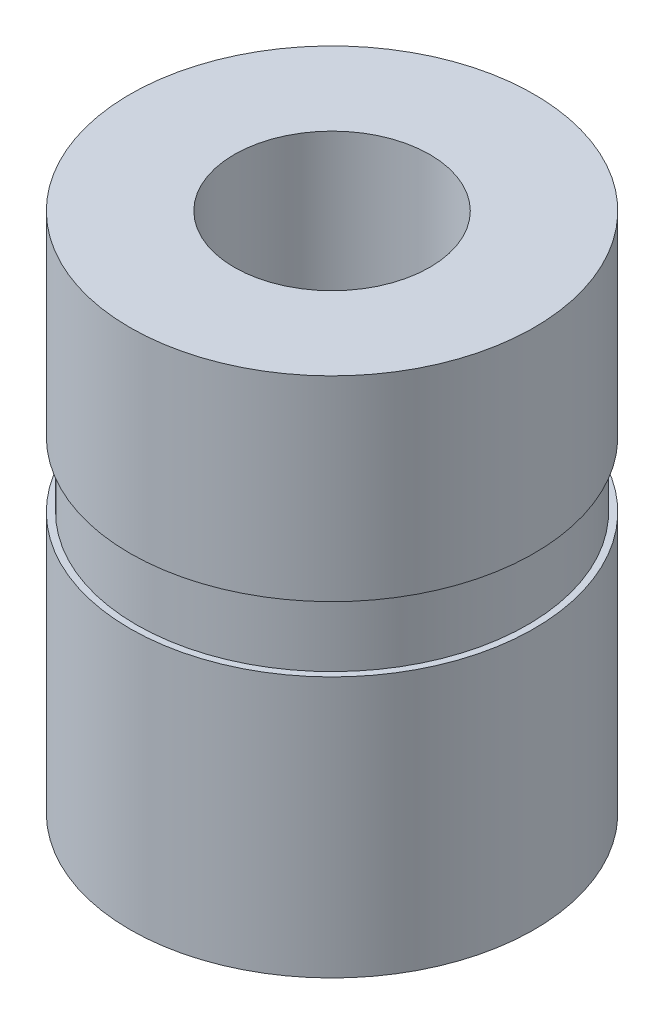
ISO-10303-21;
HEADER;
FILE_DESCRIPTION(('STEP AP214'),'2;1');
FILE_NAME('part.step','',(''),(''),'','','');
FILE_SCHEMA(('AUTOMOTIVE_DESIGN { 1 0 10303 214 1 1 1 1 }'));
ENDSEC;
DATA;
#1=APPLICATION_CONTEXT('core data for automotive mechanical design processes');
#2=APPLICATION_PROTOCOL_DEFINITION('international standard','automotive_design',2000,#1);
#3=PRODUCT_CONTEXT('',#1,'mechanical');
#4=PRODUCT('Part','Part','',(#3));
#5=PRODUCT_RELATED_PRODUCT_CATEGORY('part','',(#4));
#6=PRODUCT_DEFINITION_FORMATION('','',#4);
#7=PRODUCT_DEFINITION_CONTEXT('part definition',#1,'design');
#8=PRODUCT_DEFINITION('design','',#6,#7);
#9=PRODUCT_DEFINITION_SHAPE('','',#8);
#10=(LENGTH_UNIT() NAMED_UNIT(*) SI_UNIT(.MILLI.,.METRE.));
#11=(NAMED_UNIT(*) PLANE_ANGLE_UNIT() SI_UNIT($,.RADIAN.));
#12=(NAMED_UNIT(*) SI_UNIT($,.STERADIAN.) SOLID_ANGLE_UNIT());
#13=UNCERTAINTY_MEASURE_WITH_UNIT(LENGTH_MEASURE(1.E-05),#10,'distance_accuracy_value','');
#14=(GEOMETRIC_REPRESENTATION_CONTEXT(3) GLOBAL_UNCERTAINTY_ASSIGNED_CONTEXT((#13)) GLOBAL_UNIT_ASSIGNED_CONTEXT((#10,
#11,#12)) REPRESENTATION_CONTEXT('',''));
#15=CARTESIAN_POINT('',(0.,0.,0.));
#16=DIRECTION('',(0.,0.,1.));
#17=DIRECTION('',(1.,0.,0.));
#18=AXIS2_PLACEMENT_3D('',#15,#16,#17);
#19=CARTESIAN_POINT('',(0.,4.,0.));
#20=DIRECTION('',(0.,-1.,0.));
#21=DIRECTION('',(0.,0.,-1.));
#22=AXIS2_PLACEMENT_3D('',#19,#20,#21);
#23=CYLINDRICAL_SURFACE('',#22,3.1);
#24=CARTESIAN_POINT('',(0.,4.,0.));
#25=DIRECTION('',(0.,1.,0.));
#26=DIRECTION('',(0.,0.,1.));
#27=AXIS2_PLACEMENT_3D('',#24,#25,#26);
#28=CIRCLE('',#27,3.1);
#29=CARTESIAN_POINT('',(0.,4.,3.1));
#30=VERTEX_POINT('',#29);
#31=EDGE_CURVE('E47',#30,#30,#28,.T.);
#32=ORIENTED_EDGE('',*,*,#31,.F.);
#33=EDGE_LOOP('',(#32));
#34=FACE_BOUND('',#33,.T.);
#35=CARTESIAN_POINT('',(0.,0.,0.));
#36=DIRECTION('',(0.,1.,0.));
#37=DIRECTION('',(0.,0.,1.));
#38=AXIS2_PLACEMENT_3D('',#35,#36,#37);
#39=CIRCLE('',#38,3.1);
#40=CARTESIAN_POINT('',(0.,0.,3.1));
#41=VERTEX_POINT('',#40);
#42=EDGE_CURVE('E51',#41,#41,#39,.T.);
#43=ORIENTED_EDGE('',*,*,#42,.T.);
#44=EDGE_LOOP('',(#43));
#45=FACE_BOUND('',#44,.T.);
#46=ADVANCED_FACE('F41',(#34,#45),#23,.T.);
#47=CARTESIAN_POINT('',(0.,4.,0.));
#48=DIRECTION('',(0.,1.,0.));
#49=DIRECTION('',(0.,0.,1.));
#50=AXIS2_PLACEMENT_3D('',#47,#48,#49);
#51=PLANE('',#50);
#52=CARTESIAN_POINT('',(0.,4.,0.));
#53=DIRECTION('',(0.,1.,0.));
#54=DIRECTION('',(0.,0.,1.));
#55=AXIS2_PLACEMENT_3D('',#52,#53,#54);
#56=CIRCLE('',#55,3.);
#57=CARTESIAN_POINT('',(0.,4.,3.));
#58=VERTEX_POINT('',#57);
#59=EDGE_CURVE('E56',#58,#58,#56,.F.);
#60=ORIENTED_EDGE('',*,*,#59,.T.);
#61=EDGE_LOOP('',(#60));
#62=FACE_BOUND('',#61,.T.);
#63=ORIENTED_EDGE('',*,*,#31,.T.);
#64=EDGE_LOOP('',(#63));
#65=FACE_BOUND('',#64,.T.);
#66=ADVANCED_FACE('F93',(#62,#65),#51,.T.);
#67=CARTESIAN_POINT('',(0.,0.,0.));
#68=DIRECTION('',(0.,1.,0.));
#69=DIRECTION('',(0.,0.,1.));
#70=AXIS2_PLACEMENT_3D('',#67,#68,#69);
#71=PLANE('',#70);
#72=ORIENTED_EDGE('',*,*,#42,.F.);
#73=EDGE_LOOP('',(#72));
#74=FACE_BOUND('',#73,.T.);
#75=ADVANCED_FACE('F88',(#74),#71,.F.);
#76=CARTESIAN_POINT('',(0.,5.,0.));
#77=DIRECTION('',(0.,-1.,0.));
#78=DIRECTION('',(0.,0.,-1.));
#79=AXIS2_PLACEMENT_3D('',#76,#77,#78);
#80=CYLINDRICAL_SURFACE('',#79,3.);
#81=ORIENTED_EDGE('',*,*,#59,.F.);
#82=EDGE_LOOP('',(#81));
#83=FACE_BOUND('',#82,.T.);
#84=CARTESIAN_POINT('',(0.,5.,0.));
#85=DIRECTION('',(0.,1.,0.));
#86=DIRECTION('',(0.,0.,1.));
#87=AXIS2_PLACEMENT_3D('',#84,#85,#86);
#88=CIRCLE('',#87,3.);
#89=CARTESIAN_POINT('',(0.,5.,3.));
#90=VERTEX_POINT('',#89);
#91=EDGE_CURVE('E60',#90,#90,#88,.T.);
#92=ORIENTED_EDGE('',*,*,#91,.F.);
#93=EDGE_LOOP('',(#92));
#94=FACE_BOUND('',#93,.T.);
#95=ADVANCED_FACE('F78',(#83,#94),#80,.T.);
#96=CARTESIAN_POINT('',(0.,8.,0.));
#97=DIRECTION('',(0.,1.,0.));
#98=DIRECTION('',(0.,0.,1.));
#99=AXIS2_PLACEMENT_3D('',#96,#97,#98);
#100=PLANE('',#99);
#101=CARTESIAN_POINT('',(0.,8.,0.));
#102=DIRECTION('',(0.,1.,0.));
#103=DIRECTION('',(0.,0.,1.));
#104=AXIS2_PLACEMENT_3D('',#101,#102,#103);
#105=CIRCLE('',#104,3.1);
#106=CARTESIAN_POINT('',(0.,8.,3.1));
#107=VERTEX_POINT('',#106);
#108=EDGE_CURVE('E63',#107,#107,#105,.T.);
#109=ORIENTED_EDGE('',*,*,#108,.T.);
#110=EDGE_LOOP('',(#109));
#111=FACE_BOUND('',#110,.T.);
#112=CARTESIAN_POINT('',(0.,8.,0.));
#113=DIRECTION('',(0.,1.,0.));
#114=DIRECTION('',(0.,0.,1.));
#115=AXIS2_PLACEMENT_3D('',#112,#113,#114);
#116=CIRCLE('',#115,1.5);
#117=CARTESIAN_POINT('',(0.,8.,1.5));
#118=VERTEX_POINT('',#117);
#119=EDGE_CURVE('E67',#118,#118,#116,.T.);
#120=ORIENTED_EDGE('',*,*,#119,.F.);
#121=EDGE_LOOP('',(#120));
#122=FACE_BOUND('',#121,.T.);
#123=ADVANCED_FACE('F75',(#111,#122),#100,.T.);
#124=CARTESIAN_POINT('',(0.,5.,0.));
#125=DIRECTION('',(0.,1.,0.));
#126=DIRECTION('',(0.,0.,1.));
#127=AXIS2_PLACEMENT_3D('',#124,#125,#126);
#128=PLANE('',#127);
#129=ORIENTED_EDGE('',*,*,#91,.T.);
#130=EDGE_LOOP('',(#129));
#131=FACE_BOUND('',#130,.T.);
#132=CARTESIAN_POINT('',(0.,5.,0.));
#133=DIRECTION('',(0.,1.,0.));
#134=DIRECTION('',(0.,0.,1.));
#135=AXIS2_PLACEMENT_3D('',#132,#133,#134);
#136=CIRCLE('',#135,3.1);
#137=CARTESIAN_POINT('',(0.,5.,3.1));
#138=VERTEX_POINT('',#137);
#139=EDGE_CURVE('E64',#138,#138,#136,.T.);
#140=ORIENTED_EDGE('',*,*,#139,.F.);
#141=EDGE_LOOP('',(#140));
#142=FACE_BOUND('',#141,.T.);
#143=ADVANCED_FACE('F77',(#131,#142),#128,.F.);
#144=CARTESIAN_POINT('',(0.,8.,0.));
#145=DIRECTION('',(0.,-1.,0.));
#146=DIRECTION('',(0.,0.,-1.));
#147=AXIS2_PLACEMENT_3D('',#144,#145,#146);
#148=CYLINDRICAL_SURFACE('',#147,3.1);
#149=ORIENTED_EDGE('',*,*,#108,.F.);
#150=EDGE_LOOP('',(#149));
#151=FACE_BOUND('',#150,.T.);
#152=ORIENTED_EDGE('',*,*,#139,.T.);
#153=EDGE_LOOP('',(#152));
#154=FACE_BOUND('',#153,.T.);
#155=ADVANCED_FACE('F85',(#151,#154),#148,.T.);
#156=CARTESIAN_POINT('',(0.,8.,0.));
#157=DIRECTION('',(0.,-1.,0.));
#158=DIRECTION('',(0.,0.,-1.));
#159=AXIS2_PLACEMENT_3D('',#156,#157,#158);
#160=CYLINDRICAL_SURFACE('',#159,1.5);
#161=ORIENTED_EDGE('',*,*,#119,.T.);
#162=EDGE_LOOP('',(#161));
#163=FACE_BOUND('',#162,.T.);
#164=CARTESIAN_POINT('',(0.,5.,0.));
#165=DIRECTION('',(0.,1.,0.));
#166=DIRECTION('',(0.,0.,1.));
#167=AXIS2_PLACEMENT_3D('',#164,#165,#166);
#168=CIRCLE('',#167,1.5);
#169=CARTESIAN_POINT('',(0.,5.,1.5));
#170=VERTEX_POINT('',#169);
#171=EDGE_CURVE('E11',#170,#170,#168,.F.);
#172=ORIENTED_EDGE('',*,*,#171,.T.);
#173=EDGE_LOOP('',(#172));
#174=FACE_BOUND('',#173,.T.);
#175=ADVANCED_FACE('F73',(#163,#174),#160,.F.);
#176=CARTESIAN_POINT('',(0.,5.,0.));
#177=DIRECTION('',(0.,1.,0.));
#178=DIRECTION('',(0.,0.,1.));
#179=AXIS2_PLACEMENT_3D('',#176,#177,#178);
#180=PLANE('',#179);
#181=ORIENTED_EDGE('',*,*,#171,.F.);
#182=EDGE_LOOP('',(#181));
#183=FACE_BOUND('',#182,.T.);
#184=ADVANCED_FACE('F107',(#183),#180,.T.);
#185=CLOSED_SHELL('',(#46,#66,#75,#95,#123,#143,#155,#175,#184));
#186=MANIFOLD_SOLID_BREP('B2',#185);
#187=ADVANCED_BREP_SHAPE_REPRESENTATION('',(#18,#186),#14);
#188=SHAPE_DEFINITION_REPRESENTATION(#9,#187);
ENDSEC;
END-ISO-10303-21;
